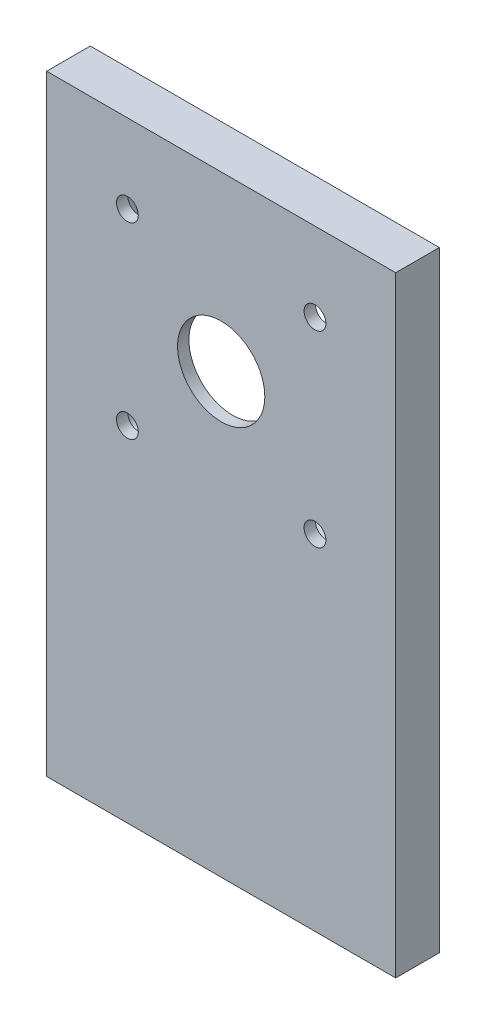
ISO-10303-21;
HEADER;
FILE_DESCRIPTION(('STEP AP214'),'2;1');
FILE_NAME('part.step','',(''),(''),'','','');
FILE_SCHEMA(('AUTOMOTIVE_DESIGN { 1 0 10303 214 1 1 1 1 }'));
ENDSEC;
DATA;
#1=APPLICATION_CONTEXT('core data for automotive mechanical design processes');
#2=APPLICATION_PROTOCOL_DEFINITION('international standard','automotive_design',2000,#1);
#3=PRODUCT_CONTEXT('',#1,'mechanical');
#4=PRODUCT('Part','Part','',(#3));
#5=PRODUCT_RELATED_PRODUCT_CATEGORY('part','',(#4));
#6=PRODUCT_DEFINITION_FORMATION('','',#4);
#7=PRODUCT_DEFINITION_CONTEXT('part definition',#1,'design');
#8=PRODUCT_DEFINITION('design','',#6,#7);
#9=PRODUCT_DEFINITION_SHAPE('','',#8);
#10=(LENGTH_UNIT() NAMED_UNIT(*) SI_UNIT(.MILLI.,.METRE.));
#11=(NAMED_UNIT(*) PLANE_ANGLE_UNIT() SI_UNIT($,.RADIAN.));
#12=(NAMED_UNIT(*) SI_UNIT($,.STERADIAN.) SOLID_ANGLE_UNIT());
#13=UNCERTAINTY_MEASURE_WITH_UNIT(LENGTH_MEASURE(1.E-05),#10,'distance_accuracy_value','');
#14=(GEOMETRIC_REPRESENTATION_CONTEXT(3) GLOBAL_UNCERTAINTY_ASSIGNED_CONTEXT((#13)) GLOBAL_UNIT_ASSIGNED_CONTEXT((#10,
#11,#12)) REPRESENTATION_CONTEXT('',''));
#15=CARTESIAN_POINT('',(0.,0.,0.));
#16=DIRECTION('',(0.,0.,1.));
#17=DIRECTION('',(1.,0.,0.));
#18=AXIS2_PLACEMENT_3D('',#15,#16,#17);
#19=CARTESIAN_POINT('',(-50.8,-88.9,12.7));
#20=DIRECTION('',(-1.,0.,0.));
#21=DIRECTION('',(0.,0.,1.));
#22=AXIS2_PLACEMENT_3D('',#19,#20,#21);
#23=PLANE('',#22);
#24=DIRECTION('',(0.,1.,0.));
#25=VECTOR('',#24,1.);
#26=CARTESIAN_POINT('',(-50.8,-88.9,0.));
#27=LINE('',#26,#25);
#28=CARTESIAN_POINT('',(-50.8,-88.9,0.));
#29=VERTEX_POINT('',#28);
#30=CARTESIAN_POINT('',(-50.8,88.9,0.));
#31=VERTEX_POINT('',#30);
#32=EDGE_CURVE('E340',#29,#31,#27,.T.);
#33=ORIENTED_EDGE('',*,*,#32,.F.);
#34=DIRECTION('',(0.,0.,-1.));
#35=VECTOR('',#34,1.);
#36=CARTESIAN_POINT('',(-50.8,-88.9,12.7));
#37=LINE('',#36,#35);
#38=CARTESIAN_POINT('',(-50.8,-88.9,12.7));
#39=VERTEX_POINT('',#38);
#40=EDGE_CURVE('E362',#39,#29,#37,.T.);
#41=ORIENTED_EDGE('',*,*,#40,.F.);
#42=DIRECTION('',(0.,1.,0.));
#43=VECTOR('',#42,1.);
#44=CARTESIAN_POINT('',(-50.8,-88.9,12.7));
#45=LINE('',#44,#43);
#46=CARTESIAN_POINT('',(-50.8,88.9,12.7));
#47=VERTEX_POINT('',#46);
#48=EDGE_CURVE('E341',#39,#47,#45,.T.);
#49=ORIENTED_EDGE('',*,*,#48,.T.);
#50=DIRECTION('',(0.,0.,-1.));
#51=VECTOR('',#50,1.);
#52=CARTESIAN_POINT('',(-50.8,88.9,12.7));
#53=LINE('',#52,#51);
#54=EDGE_CURVE('E352',#47,#31,#53,.T.);
#55=ORIENTED_EDGE('',*,*,#54,.T.);
#56=EDGE_LOOP('',(#33,#41,#49,#55));
#57=FACE_BOUND('',#56,.T.);
#58=ADVANCED_FACE('F33',(#57),#23,.T.);
#59=CARTESIAN_POINT('',(-50.8,-88.9,12.7));
#60=DIRECTION('',(0.,1.,0.));
#61=DIRECTION('',(0.,0.,1.));
#62=AXIS2_PLACEMENT_3D('',#59,#60,#61);
#63=PLANE('',#62);
#64=CARTESIAN_POINT('',(-31.75,-88.9,6.35));
#65=DIRECTION('',(0.,-1.,0.));
#66=DIRECTION('',(0.,0.,-1.));
#67=AXIS2_PLACEMENT_3D('',#64,#65,#66);
#68=CIRCLE('',#67,2.01929999999999);
#69=CARTESIAN_POINT('',(-31.75,-88.9,4.33070000000001));
#70=VERTEX_POINT('',#69);
#71=EDGE_CURVE('E328',#70,#70,#68,.T.);
#72=ORIENTED_EDGE('',*,*,#71,.F.);
#73=EDGE_LOOP('',(#72));
#74=FACE_BOUND('',#73,.T.);
#75=CARTESIAN_POINT('',(31.75,-88.9,6.35));
#76=DIRECTION('',(0.,-1.,0.));
#77=DIRECTION('',(0.,0.,-1.));
#78=AXIS2_PLACEMENT_3D('',#75,#76,#77);
#79=CIRCLE('',#78,2.01929999999999);
#80=CARTESIAN_POINT('',(31.75,-88.9,4.33070000000001));
#81=VERTEX_POINT('',#80);
#82=EDGE_CURVE('E334',#81,#81,#79,.T.);
#83=ORIENTED_EDGE('',*,*,#82,.F.);
#84=EDGE_LOOP('',(#83));
#85=FACE_BOUND('',#84,.T.);
#86=DIRECTION('',(1.,0.,0.));
#87=VECTOR('',#86,1.);
#88=CARTESIAN_POINT('',(-50.8,-88.9,0.));
#89=LINE('',#88,#87);
#90=CARTESIAN_POINT('',(50.8,-88.9,0.));
#91=VERTEX_POINT('',#90);
#92=EDGE_CURVE('E345',#29,#91,#89,.T.);
#93=ORIENTED_EDGE('',*,*,#92,.T.);
#94=DIRECTION('',(0.,0.,-1.));
#95=VECTOR('',#94,1.);
#96=CARTESIAN_POINT('',(50.8,-88.9,12.7));
#97=LINE('',#96,#95);
#98=CARTESIAN_POINT('',(50.8,-88.9,12.7));
#99=VERTEX_POINT('',#98);
#100=EDGE_CURVE('E365',#99,#91,#97,.T.);
#101=ORIENTED_EDGE('',*,*,#100,.F.);
#102=DIRECTION('',(1.,0.,0.));
#103=VECTOR('',#102,1.);
#104=CARTESIAN_POINT('',(-50.8,-88.9,12.7));
#105=LINE('',#104,#103);
#106=EDGE_CURVE('E350',#39,#99,#105,.T.);
#107=ORIENTED_EDGE('',*,*,#106,.F.);
#108=ORIENTED_EDGE('',*,*,#40,.T.);
#109=EDGE_LOOP('',(#93,#101,#107,#108));
#110=FACE_BOUND('',#109,.T.);
#111=ADVANCED_FACE('F423',(#74,#85,#110),#63,.F.);
#112=CARTESIAN_POINT('',(50.8,-88.9,12.7));
#113=DIRECTION('',(-1.,0.,0.));
#114=DIRECTION('',(0.,0.,1.));
#115=AXIS2_PLACEMENT_3D('',#112,#113,#114);
#116=PLANE('',#115);
#117=DIRECTION('',(0.,1.,0.));
#118=VECTOR('',#117,1.);
#119=CARTESIAN_POINT('',(50.8,-88.9,0.));
#120=LINE('',#119,#118);
#121=CARTESIAN_POINT('',(50.8,88.9,0.));
#122=VERTEX_POINT('',#121);
#123=EDGE_CURVE('E358',#91,#122,#120,.T.);
#124=ORIENTED_EDGE('',*,*,#123,.T.);
#125=DIRECTION('',(0.,0.,-1.));
#126=VECTOR('',#125,1.);
#127=CARTESIAN_POINT('',(50.8,88.9,12.7));
#128=LINE('',#127,#126);
#129=CARTESIAN_POINT('',(50.8,88.9,12.7));
#130=VERTEX_POINT('',#129);
#131=EDGE_CURVE('E368',#130,#122,#128,.T.);
#132=ORIENTED_EDGE('',*,*,#131,.F.);
#133=DIRECTION('',(0.,1.,0.));
#134=VECTOR('',#133,1.);
#135=CARTESIAN_POINT('',(50.8,-88.9,12.7));
#136=LINE('',#135,#134);
#137=EDGE_CURVE('E348',#99,#130,#136,.T.);
#138=ORIENTED_EDGE('',*,*,#137,.F.);
#139=ORIENTED_EDGE('',*,*,#100,.T.);
#140=EDGE_LOOP('',(#124,#132,#138,#139));
#141=FACE_BOUND('',#140,.T.);
#142=ADVANCED_FACE('F429',(#141),#116,.F.);
#143=CARTESIAN_POINT('',(-50.8,88.9,12.7));
#144=DIRECTION('',(0.,1.,0.));
#145=DIRECTION('',(0.,0.,1.));
#146=AXIS2_PLACEMENT_3D('',#143,#144,#145);
#147=PLANE('',#146);
#148=DIRECTION('',(1.,0.,0.));
#149=VECTOR('',#148,1.);
#150=CARTESIAN_POINT('',(-50.8,88.9,0.));
#151=LINE('',#150,#149);
#152=EDGE_CURVE('E355',#31,#122,#151,.T.);
#153=ORIENTED_EDGE('',*,*,#152,.F.);
#154=ORIENTED_EDGE('',*,*,#54,.F.);
#155=DIRECTION('',(1.,0.,0.));
#156=VECTOR('',#155,1.);
#157=CARTESIAN_POINT('',(-50.8,88.9,12.7));
#158=LINE('',#157,#156);
#159=EDGE_CURVE('E344',#47,#130,#158,.T.);
#160=ORIENTED_EDGE('',*,*,#159,.T.);
#161=ORIENTED_EDGE('',*,*,#131,.T.);
#162=EDGE_LOOP('',(#153,#154,#160,#161));
#163=FACE_BOUND('',#162,.T.);
#164=ADVANCED_FACE('F435',(#163),#147,.T.);
#165=CARTESIAN_POINT('',(0.,0.,12.7));
#166=DIRECTION('',(0.,0.,-1.));
#167=DIRECTION('',(-1.,0.,0.));
#168=AXIS2_PLACEMENT_3D('',#165,#166,#167);
#169=PLANE('',#168);
#170=CARTESIAN_POINT('',(-27.305,11.3116920929369,12.7));
#171=DIRECTION('',(0.,0.,1.));
#172=DIRECTION('',(1.,0.,0.));
#173=AXIS2_PLACEMENT_3D('',#170,#171,#172);
#174=CIRCLE('',#173,3.175);
#175=CARTESIAN_POINT('',(-24.13,11.3116920929369,12.7));
#176=VERTEX_POINT('',#175);
#177=EDGE_CURVE('E313',#176,#176,#174,.T.);
#178=ORIENTED_EDGE('',*,*,#177,.F.);
#179=EDGE_LOOP('',(#178));
#180=FACE_BOUND('',#179,.T.);
#181=CARTESIAN_POINT('',(27.305,11.3116920929369,12.7));
#182=DIRECTION('',(0.,0.,1.));
#183=DIRECTION('',(1.,0.,0.));
#184=AXIS2_PLACEMENT_3D('',#181,#182,#183);
#185=CIRCLE('',#184,3.175);
#186=CARTESIAN_POINT('',(30.48,11.3116920929369,12.7));
#187=VERTEX_POINT('',#186);
#188=EDGE_CURVE('E316',#187,#187,#185,.T.);
#189=ORIENTED_EDGE('',*,*,#188,.F.);
#190=EDGE_LOOP('',(#189));
#191=FACE_BOUND('',#190,.T.);
#192=CARTESIAN_POINT('',(27.305,65.9216920929369,12.7));
#193=DIRECTION('',(0.,0.,1.));
#194=DIRECTION('',(1.,0.,0.));
#195=AXIS2_PLACEMENT_3D('',#192,#193,#194);
#196=CIRCLE('',#195,3.175);
#197=CARTESIAN_POINT('',(30.48,65.9216920929369,12.7));
#198=VERTEX_POINT('',#197);
#199=EDGE_CURVE('E319',#198,#198,#196,.T.);
#200=ORIENTED_EDGE('',*,*,#199,.F.);
#201=EDGE_LOOP('',(#200));
#202=FACE_BOUND('',#201,.T.);
#203=CARTESIAN_POINT('',(-27.305,65.9216920929369,12.7));
#204=DIRECTION('',(0.,0.,1.));
#205=DIRECTION('',(1.,0.,0.));
#206=AXIS2_PLACEMENT_3D('',#203,#204,#205);
#207=CIRCLE('',#206,3.175);
#208=CARTESIAN_POINT('',(-24.13,65.9216920929369,12.7));
#209=VERTEX_POINT('',#208);
#210=EDGE_CURVE('E322',#209,#209,#207,.T.);
#211=ORIENTED_EDGE('',*,*,#210,.F.);
#212=EDGE_LOOP('',(#211));
#213=FACE_BOUND('',#212,.T.);
#214=CARTESIAN_POINT('',(0.,38.6166920929369,12.7));
#215=DIRECTION('',(0.,0.,1.));
#216=DIRECTION('',(1.,0.,0.));
#217=AXIS2_PLACEMENT_3D('',#214,#215,#216);
#218=CIRCLE('',#217,12.7);
#219=CARTESIAN_POINT('',(12.7,38.6166920929369,12.7));
#220=VERTEX_POINT('',#219);
#221=EDGE_CURVE('E325',#220,#220,#218,.T.);
#222=ORIENTED_EDGE('',*,*,#221,.F.);
#223=EDGE_LOOP('',(#222));
#224=FACE_BOUND('',#223,.T.);
#225=ORIENTED_EDGE('',*,*,#48,.F.);
#226=ORIENTED_EDGE('',*,*,#106,.T.);
#227=ORIENTED_EDGE('',*,*,#137,.T.);
#228=ORIENTED_EDGE('',*,*,#159,.F.);
#229=EDGE_LOOP('',(#225,#226,#227,#228));
#230=FACE_BOUND('',#229,.T.);
#231=ADVANCED_FACE('F486',(#180,#191,#202,#213,#224,#230),#169,.F.);
#232=CARTESIAN_POINT('',(0.,0.,0.));
#233=DIRECTION('',(0.,0.,-1.));
#234=DIRECTION('',(-1.,0.,0.));
#235=AXIS2_PLACEMENT_3D('',#232,#233,#234);
#236=PLANE('',#235);
#237=DIRECTION('',(0.,1.,0.));
#238=VECTOR('',#237,1.);
#239=CARTESIAN_POINT('',(-33.9725,4.64419209293695,0.));
#240=LINE('',#239,#238);
#241=CARTESIAN_POINT('',(-33.9725,7.81919209293695,0.));
#242=VERTEX_POINT('',#241);
#243=CARTESIAN_POINT('',(-33.9725,69.4141920929369,0.));
#244=VERTEX_POINT('',#243);
#245=EDGE_CURVE('E240',#242,#244,#240,.T.);
#246=ORIENTED_EDGE('',*,*,#245,.F.);
#247=CARTESIAN_POINT('',(-30.7975,7.81919209293695,0.));
#248=DIRECTION('',(0.,0.,-1.));
#249=DIRECTION('',(-1.,0.,0.));
#250=AXIS2_PLACEMENT_3D('',#247,#248,#249);
#251=CIRCLE('',#250,3.175);
#252=CARTESIAN_POINT('',(-30.7975,4.64419209293695,0.));
#253=VERTEX_POINT('',#252);
#254=EDGE_CURVE('E235',#242,#253,#251,.F.);
#255=ORIENTED_EDGE('',*,*,#254,.T.);
#256=DIRECTION('',(-1.,0.,0.));
#257=VECTOR('',#256,1.);
#258=CARTESIAN_POINT('',(33.9725,4.64419209293695,0.));
#259=LINE('',#258,#257);
#260=CARTESIAN_POINT('',(30.7975,4.64419209293695,0.));
#261=VERTEX_POINT('',#260);
#262=EDGE_CURVE('E263',#261,#253,#259,.T.);
#263=ORIENTED_EDGE('',*,*,#262,.F.);
#264=CARTESIAN_POINT('',(30.7975,7.81919209293695,0.));
#265=DIRECTION('',(0.,0.,-1.));
#266=DIRECTION('',(-1.,0.,0.));
#267=AXIS2_PLACEMENT_3D('',#264,#265,#266);
#268=CIRCLE('',#267,3.175);
#269=CARTESIAN_POINT('',(33.9725,7.81919209293695,0.));
#270=VERTEX_POINT('',#269);
#271=EDGE_CURVE('E233',#261,#270,#268,.F.);
#272=ORIENTED_EDGE('',*,*,#271,.T.);
#273=DIRECTION('',(0.,-1.,0.));
#274=VECTOR('',#273,1.);
#275=CARTESIAN_POINT('',(33.9725,4.64419209293695,0.));
#276=LINE('',#275,#274);
#277=CARTESIAN_POINT('',(33.9725,69.4141920929369,0.));
#278=VERTEX_POINT('',#277);
#279=EDGE_CURVE('E269',#278,#270,#276,.T.);
#280=ORIENTED_EDGE('',*,*,#279,.F.);
#281=CARTESIAN_POINT('',(30.7975,69.4141920929369,0.));
#282=DIRECTION('',(0.,0.,-1.));
#283=DIRECTION('',(-1.,0.,0.));
#284=AXIS2_PLACEMENT_3D('',#281,#282,#283);
#285=CIRCLE('',#284,3.175);
#286=CARTESIAN_POINT('',(30.7975,72.5891920929369,0.));
#287=VERTEX_POINT('',#286);
#288=EDGE_CURVE('E11',#278,#287,#285,.F.);
#289=ORIENTED_EDGE('',*,*,#288,.T.);
#290=DIRECTION('',(1.,0.,0.));
#291=VECTOR('',#290,1.);
#292=CARTESIAN_POINT('',(33.9725,72.5891920929369,0.));
#293=LINE('',#292,#291);
#294=CARTESIAN_POINT('',(-30.7975,72.5891920929369,0.));
#295=VERTEX_POINT('',#294);
#296=EDGE_CURVE('E241',#295,#287,#293,.T.);
#297=ORIENTED_EDGE('',*,*,#296,.F.);
#298=CARTESIAN_POINT('',(-30.7975,69.4141920929369,0.));
#299=DIRECTION('',(0.,0.,-1.));
#300=DIRECTION('',(-1.,0.,0.));
#301=AXIS2_PLACEMENT_3D('',#298,#299,#300);
#302=CIRCLE('',#301,3.175);
#303=EDGE_CURVE('E41',#295,#244,#302,.F.);
#304=ORIENTED_EDGE('',*,*,#303,.T.);
#305=EDGE_LOOP('',(#246,#255,#263,#272,#280,#289,#297,#304));
#306=FACE_BOUND('',#305,.T.);
#307=ORIENTED_EDGE('',*,*,#32,.T.);
#308=ORIENTED_EDGE('',*,*,#152,.T.);
#309=ORIENTED_EDGE('',*,*,#123,.F.);
#310=ORIENTED_EDGE('',*,*,#92,.F.);
#311=EDGE_LOOP('',(#307,#308,#309,#310));
#312=FACE_BOUND('',#311,.T.);
#313=ADVANCED_FACE('F238',(#306,#312),#236,.T.);
#314=CARTESIAN_POINT('',(31.75,-63.5,6.35));
#315=DIRECTION('',(0.,-1.,0.));
#316=DIRECTION('',(0.,0.,-1.));
#317=AXIS2_PLACEMENT_3D('',#314,#315,#316);
#318=CONICAL_SURFACE('',#317,2.01929999999999,1.02974425867665);
#319=CARTESIAN_POINT('',(31.75,-62.2866821519977,6.35));
#320=VERTEX_POINT('',#319);
#321=VERTEX_LOOP('',#320);
#322=FACE_BOUND('',#321,.T.);
#323=CARTESIAN_POINT('',(31.75,-63.5,6.35));
#324=DIRECTION('',(0.,-1.,0.));
#325=DIRECTION('',(0.,0.,-1.));
#326=AXIS2_PLACEMENT_3D('',#323,#324,#325);
#327=CIRCLE('',#326,2.01929999999999);
#328=CARTESIAN_POINT('',(31.75,-63.5,4.3307));
#329=VERTEX_POINT('',#328);
#330=EDGE_CURVE('E337',#329,#329,#327,.T.);
#331=ORIENTED_EDGE('',*,*,#330,.T.);
#332=EDGE_LOOP('',(#331));
#333=FACE_BOUND('',#332,.T.);
#334=ADVANCED_FACE('F481',(#322,#333),#318,.F.);
#335=CARTESIAN_POINT('',(31.75,-88.9,6.35));
#336=DIRECTION('',(0.,-1.,0.));
#337=DIRECTION('',(0.,0.,-1.));
#338=AXIS2_PLACEMENT_3D('',#335,#336,#337);
#339=CYLINDRICAL_SURFACE('',#338,2.01929999999999);
#340=ORIENTED_EDGE('',*,*,#330,.F.);
#341=EDGE_LOOP('',(#340));
#342=FACE_BOUND('',#341,.T.);
#343=ORIENTED_EDGE('',*,*,#82,.T.);
#344=EDGE_LOOP('',(#343));
#345=FACE_BOUND('',#344,.T.);
#346=ADVANCED_FACE('F477',(#342,#345),#339,.F.);
#347=CARTESIAN_POINT('',(-31.75,-63.5,6.35));
#348=DIRECTION('',(0.,-1.,0.));
#349=DIRECTION('',(0.,0.,-1.));
#350=AXIS2_PLACEMENT_3D('',#347,#348,#349);
#351=CONICAL_SURFACE('',#350,2.01929999999999,1.02974425867665);
#352=CARTESIAN_POINT('',(-31.75,-62.2866821519977,6.35));
#353=VERTEX_POINT('',#352);
#354=VERTEX_LOOP('',#353);
#355=FACE_BOUND('',#354,.T.);
#356=CARTESIAN_POINT('',(-31.75,-63.5,6.35));
#357=DIRECTION('',(0.,-1.,0.));
#358=DIRECTION('',(0.,0.,-1.));
#359=AXIS2_PLACEMENT_3D('',#356,#357,#358);
#360=CIRCLE('',#359,2.01929999999999);
#361=CARTESIAN_POINT('',(-31.75,-63.5,4.3307));
#362=VERTEX_POINT('',#361);
#363=EDGE_CURVE('E331',#362,#362,#360,.T.);
#364=ORIENTED_EDGE('',*,*,#363,.T.);
#365=EDGE_LOOP('',(#364));
#366=FACE_BOUND('',#365,.T.);
#367=ADVANCED_FACE('F473',(#355,#366),#351,.F.);
#368=CARTESIAN_POINT('',(-31.75,-88.9,6.35));
#369=DIRECTION('',(0.,-1.,0.));
#370=DIRECTION('',(0.,0.,-1.));
#371=AXIS2_PLACEMENT_3D('',#368,#369,#370);
#372=CYLINDRICAL_SURFACE('',#371,2.01929999999999);
#373=ORIENTED_EDGE('',*,*,#363,.F.);
#374=EDGE_LOOP('',(#373));
#375=FACE_BOUND('',#374,.T.);
#376=ORIENTED_EDGE('',*,*,#71,.T.);
#377=EDGE_LOOP('',(#376));
#378=FACE_BOUND('',#377,.T.);
#379=ADVANCED_FACE('F469',(#375,#378),#372,.F.);
#380=CARTESIAN_POINT('',(0.,38.6166920929369,0.));
#381=DIRECTION('',(0.,0.,1.));
#382=DIRECTION('',(1.,0.,0.));
#383=AXIS2_PLACEMENT_3D('',#380,#381,#382);
#384=CYLINDRICAL_SURFACE('',#383,12.7);
#385=CARTESIAN_POINT('',(0.,38.6166920929369,9.398));
#386=DIRECTION('',(0.,0.,1.));
#387=DIRECTION('',(1.,0.,0.));
#388=AXIS2_PLACEMENT_3D('',#385,#386,#387);
#389=CIRCLE('',#388,12.7);
#390=CARTESIAN_POINT('',(12.7,38.6166920929369,9.398));
#391=VERTEX_POINT('',#390);
#392=EDGE_CURVE('E310',#391,#391,#389,.F.);
#393=ORIENTED_EDGE('',*,*,#392,.T.);
#394=EDGE_LOOP('',(#393));
#395=FACE_BOUND('',#394,.T.);
#396=ORIENTED_EDGE('',*,*,#221,.T.);
#397=EDGE_LOOP('',(#396));
#398=FACE_BOUND('',#397,.T.);
#399=ADVANCED_FACE('F465',(#395,#398),#384,.F.);
#400=CARTESIAN_POINT('',(-27.305,65.9216920929369,0.));
#401=DIRECTION('',(0.,0.,1.));
#402=DIRECTION('',(1.,0.,0.));
#403=AXIS2_PLACEMENT_3D('',#400,#401,#402);
#404=CYLINDRICAL_SURFACE('',#403,3.175);
#405=CARTESIAN_POINT('',(-27.305,65.9216920929369,9.398));
#406=DIRECTION('',(0.,0.,1.));
#407=DIRECTION('',(1.,0.,0.));
#408=AXIS2_PLACEMENT_3D('',#405,#406,#407);
#409=CIRCLE('',#408,3.175);
#410=CARTESIAN_POINT('',(-24.13,65.9216920929369,9.398));
#411=VERTEX_POINT('',#410);
#412=EDGE_CURVE('E307',#411,#411,#409,.F.);
#413=ORIENTED_EDGE('',*,*,#412,.T.);
#414=EDGE_LOOP('',(#413));
#415=FACE_BOUND('',#414,.T.);
#416=ORIENTED_EDGE('',*,*,#210,.T.);
#417=EDGE_LOOP('',(#416));
#418=FACE_BOUND('',#417,.T.);
#419=ADVANCED_FACE('F461',(#415,#418),#404,.F.);
#420=CARTESIAN_POINT('',(27.305,65.9216920929369,0.));
#421=DIRECTION('',(0.,0.,1.));
#422=DIRECTION('',(1.,0.,0.));
#423=AXIS2_PLACEMENT_3D('',#420,#421,#422);
#424=CYLINDRICAL_SURFACE('',#423,3.175);
#425=CARTESIAN_POINT('',(27.305,65.9216920929369,9.398));
#426=DIRECTION('',(0.,0.,1.));
#427=DIRECTION('',(1.,0.,0.));
#428=AXIS2_PLACEMENT_3D('',#425,#426,#427);
#429=CIRCLE('',#428,3.175);
#430=CARTESIAN_POINT('',(30.48,65.9216920929369,9.398));
#431=VERTEX_POINT('',#430);
#432=EDGE_CURVE('E304',#431,#431,#429,.F.);
#433=ORIENTED_EDGE('',*,*,#432,.T.);
#434=EDGE_LOOP('',(#433));
#435=FACE_BOUND('',#434,.T.);
#436=ORIENTED_EDGE('',*,*,#199,.T.);
#437=EDGE_LOOP('',(#436));
#438=FACE_BOUND('',#437,.T.);
#439=ADVANCED_FACE('F457',(#435,#438),#424,.F.);
#440=CARTESIAN_POINT('',(27.305,11.3116920929369,0.));
#441=DIRECTION('',(0.,0.,1.));
#442=DIRECTION('',(1.,0.,0.));
#443=AXIS2_PLACEMENT_3D('',#440,#441,#442);
#444=CYLINDRICAL_SURFACE('',#443,3.175);
#445=CARTESIAN_POINT('',(27.305,11.3116920929369,9.398));
#446=DIRECTION('',(0.,0.,1.));
#447=DIRECTION('',(1.,0.,0.));
#448=AXIS2_PLACEMENT_3D('',#445,#446,#447);
#449=CIRCLE('',#448,3.175);
#450=CARTESIAN_POINT('',(30.48,11.3116920929369,9.398));
#451=VERTEX_POINT('',#450);
#452=EDGE_CURVE('E301',#451,#451,#449,.F.);
#453=ORIENTED_EDGE('',*,*,#452,.T.);
#454=EDGE_LOOP('',(#453));
#455=FACE_BOUND('',#454,.T.);
#456=ORIENTED_EDGE('',*,*,#188,.T.);
#457=EDGE_LOOP('',(#456));
#458=FACE_BOUND('',#457,.T.);
#459=ADVANCED_FACE('F453',(#455,#458),#444,.F.);
#460=CARTESIAN_POINT('',(-27.305,11.3116920929369,0.));
#461=DIRECTION('',(0.,0.,1.));
#462=DIRECTION('',(1.,0.,0.));
#463=AXIS2_PLACEMENT_3D('',#460,#461,#462);
#464=CYLINDRICAL_SURFACE('',#463,3.175);
#465=CARTESIAN_POINT('',(-27.305,11.3116920929369,9.398));
#466=DIRECTION('',(0.,0.,1.));
#467=DIRECTION('',(1.,0.,0.));
#468=AXIS2_PLACEMENT_3D('',#465,#466,#467);
#469=CIRCLE('',#468,3.175);
#470=CARTESIAN_POINT('',(-24.13,11.3116920929369,9.398));
#471=VERTEX_POINT('',#470);
#472=EDGE_CURVE('E300',#471,#471,#469,.F.);
#473=ORIENTED_EDGE('',*,*,#472,.T.);
#474=EDGE_LOOP('',(#473));
#475=FACE_BOUND('',#474,.T.);
#476=ORIENTED_EDGE('',*,*,#177,.T.);
#477=EDGE_LOOP('',(#476));
#478=FACE_BOUND('',#477,.T.);
#479=ADVANCED_FACE('F450',(#475,#478),#464,.F.);
#480=CARTESIAN_POINT('',(0.,0.,9.398));
#481=DIRECTION('',(0.,0.,1.));
#482=DIRECTION('',(1.,0.,0.));
#483=AXIS2_PLACEMENT_3D('',#480,#481,#482);
#484=PLANE('',#483);
#485=ORIENTED_EDGE('',*,*,#412,.F.);
#486=EDGE_LOOP('',(#485));
#487=FACE_BOUND('',#486,.T.);
#488=ORIENTED_EDGE('',*,*,#452,.F.);
#489=EDGE_LOOP('',(#488));
#490=FACE_BOUND('',#489,.T.);
#491=DIRECTION('',(-1.,0.,0.));
#492=VECTOR('',#491,1.);
#493=CARTESIAN_POINT('',(30.7975,7.81919209293695,9.398));
#494=LINE('',#493,#492);
#495=CARTESIAN_POINT('',(27.6225,7.81919209293695,9.398));
#496=VERTEX_POINT('',#495);
#497=CARTESIAN_POINT('',(-27.6225,7.81919209293695,9.398));
#498=VERTEX_POINT('',#497);
#499=EDGE_CURVE('E297',#496,#498,#494,.T.);
#500=ORIENTED_EDGE('',*,*,#499,.T.);
#501=CARTESIAN_POINT('',(-27.6225,10.994192092937,9.398));
#502=DIRECTION('',(0.,0.,1.));
#503=DIRECTION('',(1.,0.,0.));
#504=AXIS2_PLACEMENT_3D('',#501,#502,#503);
#505=CIRCLE('',#504,3.175);
#506=CARTESIAN_POINT('',(-30.7975,10.994192092937,9.398));
#507=VERTEX_POINT('',#506);
#508=EDGE_CURVE('E387',#498,#507,#505,.F.);
#509=ORIENTED_EDGE('',*,*,#508,.T.);
#510=DIRECTION('',(0.,1.,0.));
#511=VECTOR('',#510,1.);
#512=CARTESIAN_POINT('',(-30.7975,7.81919209293695,9.398));
#513=LINE('',#512,#511);
#514=CARTESIAN_POINT('',(-30.7975,66.2391920929369,9.398));
#515=VERTEX_POINT('',#514);
#516=EDGE_CURVE('E289',#507,#515,#513,.T.);
#517=ORIENTED_EDGE('',*,*,#516,.T.);
#518=CARTESIAN_POINT('',(-27.6225,66.2391920929369,9.398));
#519=DIRECTION('',(0.,0.,1.));
#520=DIRECTION('',(1.,0.,0.));
#521=AXIS2_PLACEMENT_3D('',#518,#519,#520);
#522=CIRCLE('',#521,3.175);
#523=CARTESIAN_POINT('',(-27.6225,69.4141920929369,9.398));
#524=VERTEX_POINT('',#523);
#525=EDGE_CURVE('E383',#515,#524,#522,.F.);
#526=ORIENTED_EDGE('',*,*,#525,.T.);
#527=DIRECTION('',(1.,0.,0.));
#528=VECTOR('',#527,1.);
#529=CARTESIAN_POINT('',(30.7975,69.4141920929369,9.398));
#530=LINE('',#529,#528);
#531=CARTESIAN_POINT('',(27.6225,69.4141920929369,9.398));
#532=VERTEX_POINT('',#531);
#533=EDGE_CURVE('E292',#524,#532,#530,.T.);
#534=ORIENTED_EDGE('',*,*,#533,.T.);
#535=CARTESIAN_POINT('',(27.6225,66.2391920929369,9.398));
#536=DIRECTION('',(0.,0.,1.));
#537=DIRECTION('',(1.,0.,0.));
#538=AXIS2_PLACEMENT_3D('',#535,#536,#537);
#539=CIRCLE('',#538,3.175);
#540=CARTESIAN_POINT('',(30.7975,66.2391920929369,9.398));
#541=VERTEX_POINT('',#540);
#542=EDGE_CURVE('E199',#532,#541,#539,.F.);
#543=ORIENTED_EDGE('',*,*,#542,.T.);
#544=DIRECTION('',(0.,-1.,0.));
#545=VECTOR('',#544,1.);
#546=CARTESIAN_POINT('',(30.7975,7.81919209293695,9.398));
#547=LINE('',#546,#545);
#548=CARTESIAN_POINT('',(30.7975,10.994192092937,9.398));
#549=VERTEX_POINT('',#548);
#550=EDGE_CURVE('E294',#541,#549,#547,.T.);
#551=ORIENTED_EDGE('',*,*,#550,.T.);
#552=CARTESIAN_POINT('',(27.6225,10.994192092937,9.398));
#553=DIRECTION('',(0.,0.,1.));
#554=DIRECTION('',(1.,0.,0.));
#555=AXIS2_PLACEMENT_3D('',#552,#553,#554);
#556=CIRCLE('',#555,3.175);
#557=EDGE_CURVE('E385',#549,#496,#556,.F.);
#558=ORIENTED_EDGE('',*,*,#557,.T.);
#559=EDGE_LOOP('',(#500,#509,#517,#526,#534,#543,#551,#558));
#560=FACE_BOUND('',#559,.T.);
#561=ORIENTED_EDGE('',*,*,#472,.F.);
#562=EDGE_LOOP('',(#561));
#563=FACE_BOUND('',#562,.T.);
#564=ORIENTED_EDGE('',*,*,#432,.F.);
#565=EDGE_LOOP('',(#564));
#566=FACE_BOUND('',#565,.T.);
#567=ORIENTED_EDGE('',*,*,#392,.F.);
#568=EDGE_LOOP('',(#567));
#569=FACE_BOUND('',#568,.T.);
#570=ADVANCED_FACE('F394',(#487,#490,#560,#563,#566,#569),#484,.F.);
#571=CARTESIAN_POINT('',(-30.7975,7.81919209293695,9.398));
#572=DIRECTION('',(-1.,0.,0.));
#573=DIRECTION('',(0.,0.,1.));
#574=AXIS2_PLACEMENT_3D('',#571,#572,#573);
#575=PLANE('',#574);
#576=DIRECTION('',(0.,0.,-1.));
#577=VECTOR('',#576,1.);
#578=CARTESIAN_POINT('',(-30.7975,10.994192092937,0.));
#579=LINE('',#578,#577);
#580=CARTESIAN_POINT('',(-30.7975,10.994192092937,4.445));
#581=VERTEX_POINT('',#580);
#582=EDGE_CURVE('E374',#507,#581,#579,.T.);
#583=ORIENTED_EDGE('',*,*,#582,.T.);
#584=DIRECTION('',(0.,1.,0.));
#585=VECTOR('',#584,1.);
#586=CARTESIAN_POINT('',(-30.7975,7.81919209293695,4.445));
#587=LINE('',#586,#585);
#588=CARTESIAN_POINT('',(-30.7975,66.2391920929369,4.445));
#589=VERTEX_POINT('',#588);
#590=EDGE_CURVE('E283',#581,#589,#587,.T.);
#591=ORIENTED_EDGE('',*,*,#590,.T.);
#592=DIRECTION('',(0.,0.,-1.));
#593=VECTOR('',#592,1.);
#594=CARTESIAN_POINT('',(-30.7975,66.2391920929369,9.398));
#595=LINE('',#594,#593);
#596=EDGE_CURVE('E364',#589,#515,#595,.F.);
#597=ORIENTED_EDGE('',*,*,#596,.T.);
#598=ORIENTED_EDGE('',*,*,#516,.F.);
#599=EDGE_LOOP('',(#583,#591,#597,#598));
#600=FACE_BOUND('',#599,.T.);
#601=ADVANCED_FACE('F409',(#600),#575,.F.);
#602=CARTESIAN_POINT('',(30.7975,7.81919209293695,9.398));
#603=DIRECTION('',(0.,-1.,0.));
#604=DIRECTION('',(0.,0.,-1.));
#605=AXIS2_PLACEMENT_3D('',#602,#603,#604);
#606=PLANE('',#605);
#607=DIRECTION('',(0.,0.,-1.));
#608=VECTOR('',#607,1.);
#609=CARTESIAN_POINT('',(27.6225,7.81919209293695,0.));
#610=LINE('',#609,#608);
#611=CARTESIAN_POINT('',(27.6225,7.81919209293695,4.445));
#612=VERTEX_POINT('',#611);
#613=EDGE_CURVE('E377',#496,#612,#610,.T.);
#614=ORIENTED_EDGE('',*,*,#613,.T.);
#615=DIRECTION('',(-1.,0.,0.));
#616=VECTOR('',#615,1.);
#617=CARTESIAN_POINT('',(30.7975,7.81919209293695,4.445));
#618=LINE('',#617,#616);
#619=CARTESIAN_POINT('',(-27.6225,7.81919209293695,4.445));
#620=VERTEX_POINT('',#619);
#621=EDGE_CURVE('E280',#612,#620,#618,.T.);
#622=ORIENTED_EDGE('',*,*,#621,.T.);
#623=DIRECTION('',(0.,0.,-1.));
#624=VECTOR('',#623,1.);
#625=CARTESIAN_POINT('',(-27.6225,7.81919209293695,9.398));
#626=LINE('',#625,#624);
#627=EDGE_CURVE('E380',#620,#498,#626,.F.);
#628=ORIENTED_EDGE('',*,*,#627,.T.);
#629=ORIENTED_EDGE('',*,*,#499,.F.);
#630=EDGE_LOOP('',(#614,#622,#628,#629));
#631=FACE_BOUND('',#630,.T.);
#632=ADVANCED_FACE('F401',(#631),#606,.F.);
#633=CARTESIAN_POINT('',(30.7975,7.81919209293695,9.398));
#634=DIRECTION('',(1.,0.,0.));
#635=DIRECTION('',(0.,0.,-1.));
#636=AXIS2_PLACEMENT_3D('',#633,#634,#635);
#637=PLANE('',#636);
#638=DIRECTION('',(0.,0.,-1.));
#639=VECTOR('',#638,1.);
#640=CARTESIAN_POINT('',(30.7975,66.2391920929369,0.));
#641=LINE('',#640,#639);
#642=CARTESIAN_POINT('',(30.7975,66.2391920929369,4.445));
#643=VERTEX_POINT('',#642);
#644=EDGE_CURVE('E203',#541,#643,#641,.T.);
#645=ORIENTED_EDGE('',*,*,#644,.T.);
#646=DIRECTION('',(0.,-1.,0.));
#647=VECTOR('',#646,1.);
#648=CARTESIAN_POINT('',(30.7975,7.81919209293695,4.445));
#649=LINE('',#648,#647);
#650=CARTESIAN_POINT('',(30.7975,10.994192092937,4.445));
#651=VERTEX_POINT('',#650);
#652=EDGE_CURVE('E180',#643,#651,#649,.T.);
#653=ORIENTED_EDGE('',*,*,#652,.T.);
#654=DIRECTION('',(0.,0.,-1.));
#655=VECTOR('',#654,1.);
#656=CARTESIAN_POINT('',(30.7975,10.994192092937,9.398));
#657=LINE('',#656,#655);
#658=EDGE_CURVE('E200',#651,#549,#657,.F.);
#659=ORIENTED_EDGE('',*,*,#658,.T.);
#660=ORIENTED_EDGE('',*,*,#550,.F.);
#661=EDGE_LOOP('',(#645,#653,#659,#660));
#662=FACE_BOUND('',#661,.T.);
#663=ADVANCED_FACE('F390',(#662),#637,.F.);
#664=CARTESIAN_POINT('',(30.7975,69.4141920929369,9.398));
#665=DIRECTION('',(0.,1.,0.));
#666=DIRECTION('',(0.,0.,1.));
#667=AXIS2_PLACEMENT_3D('',#664,#665,#666);
#668=PLANE('',#667);
#669=DIRECTION('',(0.,0.,-1.));
#670=VECTOR('',#669,1.);
#671=CARTESIAN_POINT('',(-27.6225,69.4141920929369,0.));
#672=LINE('',#671,#670);
#673=CARTESIAN_POINT('',(-27.6225,69.4141920929369,4.445));
#674=VERTEX_POINT('',#673);
#675=EDGE_CURVE('E186',#524,#674,#672,.T.);
#676=ORIENTED_EDGE('',*,*,#675,.T.);
#677=DIRECTION('',(1.,0.,0.));
#678=VECTOR('',#677,1.);
#679=CARTESIAN_POINT('',(30.7975,69.4141920929369,4.445));
#680=LINE('',#679,#678);
#681=CARTESIAN_POINT('',(27.6225,69.4141920929369,4.445));
#682=VERTEX_POINT('',#681);
#683=EDGE_CURVE('E177',#674,#682,#680,.T.);
#684=ORIENTED_EDGE('',*,*,#683,.T.);
#685=DIRECTION('',(0.,0.,-1.));
#686=VECTOR('',#685,1.);
#687=CARTESIAN_POINT('',(27.6225,69.4141920929369,9.398));
#688=LINE('',#687,#686);
#689=EDGE_CURVE('E192',#682,#532,#688,.F.);
#690=ORIENTED_EDGE('',*,*,#689,.T.);
#691=ORIENTED_EDGE('',*,*,#533,.F.);
#692=EDGE_LOOP('',(#676,#684,#690,#691));
#693=FACE_BOUND('',#692,.T.);
#694=ADVANCED_FACE('F190',(#693),#668,.F.);
#695=CARTESIAN_POINT('',(-27.6225,10.994192092937,9.398));
#696=DIRECTION('',(0.,0.,1.));
#697=DIRECTION('',(1.,0.,0.));
#698=AXIS2_PLACEMENT_3D('',#695,#696,#697);
#699=CYLINDRICAL_SURFACE('',#698,3.175);
#700=ORIENTED_EDGE('',*,*,#627,.F.);
#701=CARTESIAN_POINT('',(-27.6225,10.994192092937,4.445));
#702=DIRECTION('',(0.,0.,1.));
#703=DIRECTION('',(1.,0.,0.));
#704=AXIS2_PLACEMENT_3D('',#701,#702,#703);
#705=CIRCLE('',#704,3.175);
#706=EDGE_CURVE('E286',#620,#581,#705,.F.);
#707=ORIENTED_EDGE('',*,*,#706,.T.);
#708=ORIENTED_EDGE('',*,*,#582,.F.);
#709=ORIENTED_EDGE('',*,*,#508,.F.);
#710=EDGE_LOOP('',(#700,#707,#708,#709));
#711=FACE_BOUND('',#710,.T.);
#712=ADVANCED_FACE('F407',(#711),#699,.F.);
#713=CARTESIAN_POINT('',(27.6225,10.994192092937,9.398));
#714=DIRECTION('',(0.,0.,1.));
#715=DIRECTION('',(1.,0.,0.));
#716=AXIS2_PLACEMENT_3D('',#713,#714,#715);
#717=CYLINDRICAL_SURFACE('',#716,3.175);
#718=ORIENTED_EDGE('',*,*,#658,.F.);
#719=CARTESIAN_POINT('',(27.6225,10.994192092937,4.445));
#720=DIRECTION('',(0.,0.,1.));
#721=DIRECTION('',(1.,0.,0.));
#722=AXIS2_PLACEMENT_3D('',#719,#720,#721);
#723=CIRCLE('',#722,3.175);
#724=EDGE_CURVE('E277',#651,#612,#723,.F.);
#725=ORIENTED_EDGE('',*,*,#724,.T.);
#726=ORIENTED_EDGE('',*,*,#613,.F.);
#727=ORIENTED_EDGE('',*,*,#557,.F.);
#728=EDGE_LOOP('',(#718,#725,#726,#727));
#729=FACE_BOUND('',#728,.T.);
#730=ADVANCED_FACE('F399',(#729),#717,.F.);
#731=CARTESIAN_POINT('',(-27.6225,66.2391920929369,9.398));
#732=DIRECTION('',(0.,0.,1.));
#733=DIRECTION('',(1.,0.,0.));
#734=AXIS2_PLACEMENT_3D('',#731,#732,#733);
#735=CYLINDRICAL_SURFACE('',#734,3.175);
#736=ORIENTED_EDGE('',*,*,#596,.F.);
#737=CARTESIAN_POINT('',(-27.6225,66.2391920929369,4.445));
#738=DIRECTION('',(0.,0.,1.));
#739=DIRECTION('',(1.,0.,0.));
#740=AXIS2_PLACEMENT_3D('',#737,#738,#739);
#741=CIRCLE('',#740,3.175);
#742=EDGE_CURVE('E275',#589,#674,#741,.F.);
#743=ORIENTED_EDGE('',*,*,#742,.T.);
#744=ORIENTED_EDGE('',*,*,#675,.F.);
#745=ORIENTED_EDGE('',*,*,#525,.F.);
#746=EDGE_LOOP('',(#736,#743,#744,#745));
#747=FACE_BOUND('',#746,.T.);
#748=ADVANCED_FACE('F413',(#747),#735,.F.);
#749=CARTESIAN_POINT('',(27.6225,66.2391920929369,9.398));
#750=DIRECTION('',(0.,0.,1.));
#751=DIRECTION('',(1.,0.,0.));
#752=AXIS2_PLACEMENT_3D('',#749,#750,#751);
#753=CYLINDRICAL_SURFACE('',#752,3.175);
#754=ORIENTED_EDGE('',*,*,#689,.F.);
#755=CARTESIAN_POINT('',(27.6225,66.2391920929369,4.445));
#756=DIRECTION('',(0.,0.,1.));
#757=DIRECTION('',(1.,0.,0.));
#758=AXIS2_PLACEMENT_3D('',#755,#756,#757);
#759=CIRCLE('',#758,3.175);
#760=EDGE_CURVE('E174',#682,#643,#759,.F.);
#761=ORIENTED_EDGE('',*,*,#760,.T.);
#762=ORIENTED_EDGE('',*,*,#644,.F.);
#763=ORIENTED_EDGE('',*,*,#542,.F.);
#764=EDGE_LOOP('',(#754,#761,#762,#763));
#765=FACE_BOUND('',#764,.T.);
#766=ADVANCED_FACE('F198',(#765),#753,.F.);
#767=CARTESIAN_POINT('',(0.,0.,4.445));
#768=DIRECTION('',(0.,0.,1.));
#769=DIRECTION('',(1.,0.,0.));
#770=AXIS2_PLACEMENT_3D('',#767,#768,#769);
#771=PLANE('',#770);
#772=DIRECTION('',(0.,-1.,0.));
#773=VECTOR('',#772,1.);
#774=CARTESIAN_POINT('',(33.9725,4.64419209293695,4.445));
#775=LINE('',#774,#773);
#776=CARTESIAN_POINT('',(33.9725,69.4141920929369,4.445));
#777=VERTEX_POINT('',#776);
#778=CARTESIAN_POINT('',(33.9725,7.81919209293695,4.445));
#779=VERTEX_POINT('',#778);
#780=EDGE_CURVE('E260',#777,#779,#775,.T.);
#781=ORIENTED_EDGE('',*,*,#780,.T.);
#782=CARTESIAN_POINT('',(30.7975,7.81919209293695,4.445));
#783=DIRECTION('',(0.,0.,1.));
#784=DIRECTION('',(1.,0.,0.));
#785=AXIS2_PLACEMENT_3D('',#782,#783,#784);
#786=CIRCLE('',#785,3.175);
#787=CARTESIAN_POINT('',(30.7975,4.64419209293695,4.445));
#788=VERTEX_POINT('',#787);
#789=EDGE_CURVE('E222',#779,#788,#786,.F.);
#790=ORIENTED_EDGE('',*,*,#789,.T.);
#791=DIRECTION('',(-1.,0.,0.));
#792=VECTOR('',#791,1.);
#793=CARTESIAN_POINT('',(33.9725,4.64419209293695,4.445));
#794=LINE('',#793,#792);
#795=CARTESIAN_POINT('',(-30.7975,4.64419209293695,4.445));
#796=VERTEX_POINT('',#795);
#797=EDGE_CURVE('E195',#788,#796,#794,.T.);
#798=ORIENTED_EDGE('',*,*,#797,.T.);
#799=CARTESIAN_POINT('',(-30.7975,7.81919209293695,4.445));
#800=DIRECTION('',(0.,0.,1.));
#801=DIRECTION('',(1.,0.,0.));
#802=AXIS2_PLACEMENT_3D('',#799,#800,#801);
#803=CIRCLE('',#802,3.175);
#804=CARTESIAN_POINT('',(-33.9725,7.81919209293695,4.445));
#805=VERTEX_POINT('',#804);
#806=EDGE_CURVE('E220',#796,#805,#803,.F.);
#807=ORIENTED_EDGE('',*,*,#806,.T.);
#808=DIRECTION('',(0.,1.,0.));
#809=VECTOR('',#808,1.);
#810=CARTESIAN_POINT('',(-33.9725,4.64419209293695,4.445));
#811=LINE('',#810,#809);
#812=CARTESIAN_POINT('',(-33.9725,69.4141920929369,4.445));
#813=VERTEX_POINT('',#812);
#814=EDGE_CURVE('E256',#805,#813,#811,.T.);
#815=ORIENTED_EDGE('',*,*,#814,.T.);
#816=CARTESIAN_POINT('',(-30.7975,69.4141920929369,4.445));
#817=DIRECTION('',(0.,0.,1.));
#818=DIRECTION('',(1.,0.,0.));
#819=AXIS2_PLACEMENT_3D('',#816,#817,#818);
#820=CIRCLE('',#819,3.175);
#821=CARTESIAN_POINT('',(-30.7975,72.5891920929369,4.445));
#822=VERTEX_POINT('',#821);
#823=EDGE_CURVE('E218',#813,#822,#820,.F.);
#824=ORIENTED_EDGE('',*,*,#823,.T.);
#825=DIRECTION('',(1.,0.,0.));
#826=VECTOR('',#825,1.);
#827=CARTESIAN_POINT('',(33.9725,72.5891920929369,4.445));
#828=LINE('',#827,#826);
#829=CARTESIAN_POINT('',(30.7975,72.5891920929369,4.445));
#830=VERTEX_POINT('',#829);
#831=EDGE_CURVE('E254',#822,#830,#828,.T.);
#832=ORIENTED_EDGE('',*,*,#831,.T.);
#833=CARTESIAN_POINT('',(30.7975,69.4141920929369,4.445));
#834=DIRECTION('',(0.,0.,1.));
#835=DIRECTION('',(1.,0.,0.));
#836=AXIS2_PLACEMENT_3D('',#833,#834,#835);
#837=CIRCLE('',#836,3.175);
#838=EDGE_CURVE('E216',#830,#777,#837,.F.);
#839=ORIENTED_EDGE('',*,*,#838,.T.);
#840=EDGE_LOOP('',(#781,#790,#798,#807,#815,#824,#832,#839));
#841=FACE_BOUND('',#840,.T.);
#842=ORIENTED_EDGE('',*,*,#621,.F.);
#843=ORIENTED_EDGE('',*,*,#724,.F.);
#844=ORIENTED_EDGE('',*,*,#652,.F.);
#845=ORIENTED_EDGE('',*,*,#760,.F.);
#846=ORIENTED_EDGE('',*,*,#683,.F.);
#847=ORIENTED_EDGE('',*,*,#742,.F.);
#848=ORIENTED_EDGE('',*,*,#590,.F.);
#849=ORIENTED_EDGE('',*,*,#706,.F.);
#850=EDGE_LOOP('',(#842,#843,#844,#845,#846,#847,#848,#849));
#851=FACE_BOUND('',#850,.T.);
#852=ADVANCED_FACE('F176',(#841,#851),#771,.F.);
#853=CARTESIAN_POINT('',(-33.9725,4.64419209293695,4.445));
#854=DIRECTION('',(-1.,0.,0.));
#855=DIRECTION('',(0.,0.,1.));
#856=AXIS2_PLACEMENT_3D('',#853,#854,#855);
#857=PLANE('',#856);
#858=ORIENTED_EDGE('',*,*,#814,.F.);
#859=DIRECTION('',(0.,0.,-1.));
#860=VECTOR('',#859,1.);
#861=CARTESIAN_POINT('',(-33.9725,7.81919209293695,0.));
#862=LINE('',#861,#860);
#863=EDGE_CURVE('E226',#805,#242,#862,.T.);
#864=ORIENTED_EDGE('',*,*,#863,.T.);
#865=ORIENTED_EDGE('',*,*,#245,.T.);
#866=DIRECTION('',(0.,0.,-1.));
#867=VECTOR('',#866,1.);
#868=CARTESIAN_POINT('',(-33.9725,69.4141920929369,4.445));
#869=LINE('',#868,#867);
#870=EDGE_CURVE('E224',#244,#813,#869,.F.);
#871=ORIENTED_EDGE('',*,*,#870,.T.);
#872=EDGE_LOOP('',(#858,#864,#865,#871));
#873=FACE_BOUND('',#872,.T.);
#874=ADVANCED_FACE('F244',(#873),#857,.F.);
#875=CARTESIAN_POINT('',(33.9725,4.64419209293695,4.445));
#876=DIRECTION('',(0.,-1.,0.));
#877=DIRECTION('',(0.,0.,-1.));
#878=AXIS2_PLACEMENT_3D('',#875,#876,#877);
#879=PLANE('',#878);
#880=ORIENTED_EDGE('',*,*,#797,.F.);
#881=DIRECTION('',(0.,0.,-1.));
#882=VECTOR('',#881,1.);
#883=CARTESIAN_POINT('',(30.7975,4.64419209293695,0.));
#884=LINE('',#883,#882);
#885=EDGE_CURVE('E208',#788,#261,#884,.T.);
#886=ORIENTED_EDGE('',*,*,#885,.T.);
#887=ORIENTED_EDGE('',*,*,#262,.T.);
#888=DIRECTION('',(0.,0.,-1.));
#889=VECTOR('',#888,1.);
#890=CARTESIAN_POINT('',(-30.7975,4.64419209293695,4.445));
#891=LINE('',#890,#889);
#892=EDGE_CURVE('E185',#253,#796,#891,.F.);
#893=ORIENTED_EDGE('',*,*,#892,.T.);
#894=EDGE_LOOP('',(#880,#886,#887,#893));
#895=FACE_BOUND('',#894,.T.);
#896=ADVANCED_FACE('F613',(#895),#879,.F.);
#897=CARTESIAN_POINT('',(33.9725,4.64419209293695,4.445));
#898=DIRECTION('',(1.,0.,0.));
#899=DIRECTION('',(0.,0.,-1.));
#900=AXIS2_PLACEMENT_3D('',#897,#898,#899);
#901=PLANE('',#900);
#902=ORIENTED_EDGE('',*,*,#279,.T.);
#903=DIRECTION('',(0.,0.,-1.));
#904=VECTOR('',#903,1.);
#905=CARTESIAN_POINT('',(33.9725,7.81919209293695,4.445));
#906=LINE('',#905,#904);
#907=EDGE_CURVE('E214',#270,#779,#906,.F.);
#908=ORIENTED_EDGE('',*,*,#907,.T.);
#909=ORIENTED_EDGE('',*,*,#780,.F.);
#910=DIRECTION('',(0.,0.,-1.));
#911=VECTOR('',#910,1.);
#912=CARTESIAN_POINT('',(33.9725,69.4141920929369,0.));
#913=LINE('',#912,#911);
#914=EDGE_CURVE('E211',#777,#278,#913,.T.);
#915=ORIENTED_EDGE('',*,*,#914,.T.);
#916=EDGE_LOOP('',(#902,#908,#909,#915));
#917=FACE_BOUND('',#916,.T.);
#918=ADVANCED_FACE('F620',(#917),#901,.F.);
#919=CARTESIAN_POINT('',(33.9725,72.5891920929369,4.445));
#920=DIRECTION('',(0.,1.,0.));
#921=DIRECTION('',(0.,0.,1.));
#922=AXIS2_PLACEMENT_3D('',#919,#920,#921);
#923=PLANE('',#922);
#924=ORIENTED_EDGE('',*,*,#831,.F.);
#925=DIRECTION('',(0.,0.,-1.));
#926=VECTOR('',#925,1.);
#927=CARTESIAN_POINT('',(-30.7975,72.5891920929369,0.));
#928=LINE('',#927,#926);
#929=EDGE_CURVE('E231',#822,#295,#928,.T.);
#930=ORIENTED_EDGE('',*,*,#929,.T.);
#931=ORIENTED_EDGE('',*,*,#296,.T.);
#932=DIRECTION('',(0.,0.,-1.));
#933=VECTOR('',#932,1.);
#934=CARTESIAN_POINT('',(30.7975,72.5891920929369,4.445));
#935=LINE('',#934,#933);
#936=EDGE_CURVE('E229',#287,#830,#935,.F.);
#937=ORIENTED_EDGE('',*,*,#936,.T.);
#938=EDGE_LOOP('',(#924,#930,#931,#937));
#939=FACE_BOUND('',#938,.T.);
#940=ADVANCED_FACE('F258',(#939),#923,.F.);
#941=CARTESIAN_POINT('',(30.7975,7.81919209293695,4.445));
#942=DIRECTION('',(0.,0.,1.));
#943=DIRECTION('',(1.,0.,0.));
#944=AXIS2_PLACEMENT_3D('',#941,#942,#943);
#945=CYLINDRICAL_SURFACE('',#944,3.175);
#946=ORIENTED_EDGE('',*,*,#789,.F.);
#947=ORIENTED_EDGE('',*,*,#907,.F.);
#948=ORIENTED_EDGE('',*,*,#271,.F.);
#949=ORIENTED_EDGE('',*,*,#885,.F.);
#950=EDGE_LOOP('',(#946,#947,#948,#949));
#951=FACE_BOUND('',#950,.T.);
#952=ADVANCED_FACE('F635',(#951),#945,.F.);
#953=CARTESIAN_POINT('',(-30.7975,7.81919209293695,4.445));
#954=DIRECTION('',(0.,0.,1.));
#955=DIRECTION('',(1.,0.,0.));
#956=AXIS2_PLACEMENT_3D('',#953,#954,#955);
#957=CYLINDRICAL_SURFACE('',#956,3.175);
#958=ORIENTED_EDGE('',*,*,#806,.F.);
#959=ORIENTED_EDGE('',*,*,#892,.F.);
#960=ORIENTED_EDGE('',*,*,#254,.F.);
#961=ORIENTED_EDGE('',*,*,#863,.F.);
#962=EDGE_LOOP('',(#958,#959,#960,#961));
#963=FACE_BOUND('',#962,.T.);
#964=ADVANCED_FACE('F642',(#963),#957,.F.);
#965=CARTESIAN_POINT('',(-30.7975,69.4141920929369,4.445));
#966=DIRECTION('',(0.,0.,1.));
#967=DIRECTION('',(1.,0.,0.));
#968=AXIS2_PLACEMENT_3D('',#965,#966,#967);
#969=CYLINDRICAL_SURFACE('',#968,3.175);
#970=ORIENTED_EDGE('',*,*,#823,.F.);
#971=ORIENTED_EDGE('',*,*,#870,.F.);
#972=ORIENTED_EDGE('',*,*,#303,.F.);
#973=ORIENTED_EDGE('',*,*,#929,.F.);
#974=EDGE_LOOP('',(#970,#971,#972,#973));
#975=FACE_BOUND('',#974,.T.);
#976=ADVANCED_FACE('F249',(#975),#969,.F.);
#977=CARTESIAN_POINT('',(30.7975,69.4141920929369,4.445));
#978=DIRECTION('',(0.,0.,1.));
#979=DIRECTION('',(1.,0.,0.));
#980=AXIS2_PLACEMENT_3D('',#977,#978,#979);
#981=CYLINDRICAL_SURFACE('',#980,3.175);
#982=ORIENTED_EDGE('',*,*,#838,.F.);
#983=ORIENTED_EDGE('',*,*,#936,.F.);
#984=ORIENTED_EDGE('',*,*,#288,.F.);
#985=ORIENTED_EDGE('',*,*,#914,.F.);
#986=EDGE_LOOP('',(#982,#983,#984,#985));
#987=FACE_BOUND('',#986,.T.);
#988=ADVANCED_FACE('F35',(#987),#981,.F.);
#989=CLOSED_SHELL('',(#58,#111,#142,#164,#231,#313,#334,#346,#367,#379,#399,#419,#439,#459,#479,
#570,#601,#632,#663,#694,#712,#730,#748,#766,#852,#874,#896,#918,#940,#952,#964,#976,#988));
#990=MANIFOLD_SOLID_BREP('B2',#989);
#991=ADVANCED_BREP_SHAPE_REPRESENTATION('',(#18,#990),#14);
#992=SHAPE_DEFINITION_REPRESENTATION(#9,#991);
ENDSEC;
END-ISO-10303-21;
